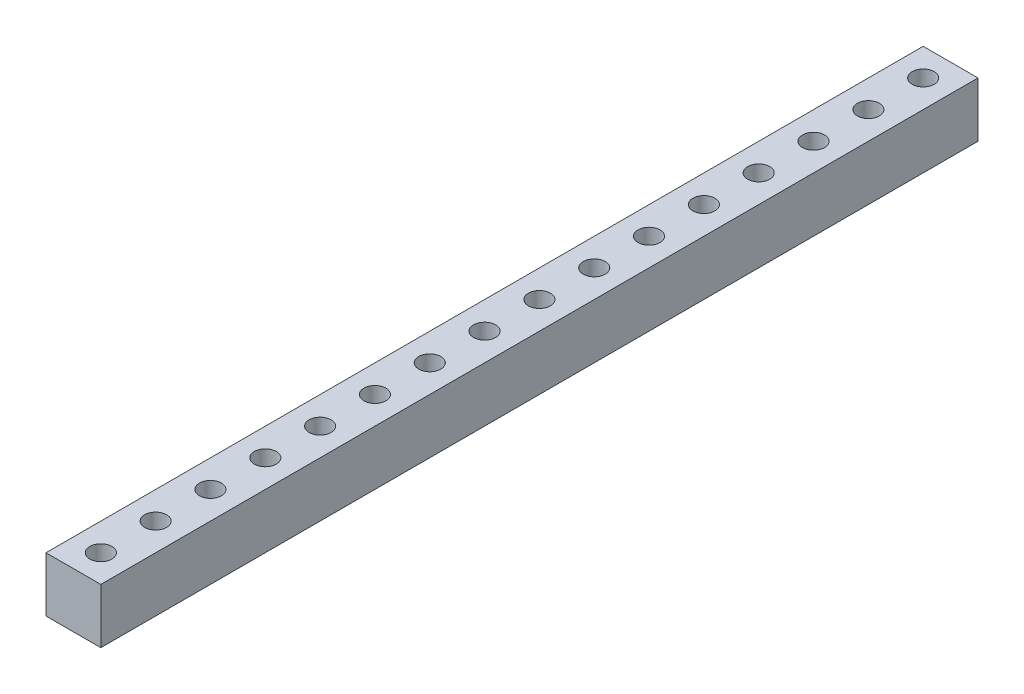
ISO-10303-21;
HEADER;
FILE_DESCRIPTION(('STEP AP214'),'2;1');
FILE_NAME('part.step','',(''),(''),'','','');
FILE_SCHEMA(('AUTOMOTIVE_DESIGN { 1 0 10303 214 1 1 1 1 }'));
ENDSEC;
DATA;
#1=APPLICATION_CONTEXT('core data for automotive mechanical design processes');
#2=APPLICATION_PROTOCOL_DEFINITION('international standard','automotive_design',2000,#1);
#3=PRODUCT_CONTEXT('',#1,'mechanical');
#4=PRODUCT('Part','Part','',(#3));
#5=PRODUCT_RELATED_PRODUCT_CATEGORY('part','',(#4));
#6=PRODUCT_DEFINITION_FORMATION('','',#4);
#7=PRODUCT_DEFINITION_CONTEXT('part definition',#1,'design');
#8=PRODUCT_DEFINITION('design','',#6,#7);
#9=PRODUCT_DEFINITION_SHAPE('','',#8);
#10=(LENGTH_UNIT() NAMED_UNIT(*) SI_UNIT(.MILLI.,.METRE.));
#11=(NAMED_UNIT(*) PLANE_ANGLE_UNIT() SI_UNIT($,.RADIAN.));
#12=(NAMED_UNIT(*) SI_UNIT($,.STERADIAN.) SOLID_ANGLE_UNIT());
#13=UNCERTAINTY_MEASURE_WITH_UNIT(LENGTH_MEASURE(1.E-05),#10,'distance_accuracy_value','');
#14=(GEOMETRIC_REPRESENTATION_CONTEXT(3) GLOBAL_UNCERTAINTY_ASSIGNED_CONTEXT((#13)) GLOBAL_UNIT_ASSIGNED_CONTEXT((#10,
#11,#12)) REPRESENTATION_CONTEXT('',''));
#15=CARTESIAN_POINT('',(0.,0.,0.));
#16=DIRECTION('',(0.,0.,1.));
#17=DIRECTION('',(1.,0.,0.));
#18=AXIS2_PLACEMENT_3D('',#15,#16,#17);
#19=CARTESIAN_POINT('',(2.54,1.27,20.32));
#20=DIRECTION('',(0.,-1.,0.));
#21=DIRECTION('',(0.,0.,-1.));
#22=AXIS2_PLACEMENT_3D('',#19,#20,#21);
#23=PLANE('',#22);
#24=CARTESIAN_POINT('',(1.27000000000001,1.27,-19.05));
#25=DIRECTION('',(0.,1.,0.));
#26=DIRECTION('',(0.,0.,1.));
#27=AXIS2_PLACEMENT_3D('',#24,#25,#26);
#28=CIRCLE('',#27,0.509999999999988);
#29=CARTESIAN_POINT('',(1.27000000000001,1.27,-18.54));
#30=VERTEX_POINT('',#29);
#31=EDGE_CURVE('E252',#30,#30,#28,.T.);
#32=ORIENTED_EDGE('',*,*,#31,.F.);
#33=EDGE_LOOP('',(#32));
#34=FACE_BOUND('',#33,.T.);
#35=CARTESIAN_POINT('',(1.27000000000001,1.27,-16.51));
#36=DIRECTION('',(0.,1.,0.));
#37=DIRECTION('',(0.,0.,1.));
#38=AXIS2_PLACEMENT_3D('',#35,#36,#37);
#39=CIRCLE('',#38,0.509999999999988);
#40=CARTESIAN_POINT('',(1.27000000000001,1.27,-16.));
#41=VERTEX_POINT('',#40);
#42=EDGE_CURVE('E244',#41,#41,#39,.T.);
#43=ORIENTED_EDGE('',*,*,#42,.F.);
#44=EDGE_LOOP('',(#43));
#45=FACE_BOUND('',#44,.T.);
#46=CARTESIAN_POINT('',(1.27000000000001,1.27,-13.97));
#47=DIRECTION('',(0.,1.,0.));
#48=DIRECTION('',(0.,0.,1.));
#49=AXIS2_PLACEMENT_3D('',#46,#47,#48);
#50=CIRCLE('',#49,0.509999999999988);
#51=CARTESIAN_POINT('',(1.27000000000001,1.27,-13.46));
#52=VERTEX_POINT('',#51);
#53=EDGE_CURVE('E236',#52,#52,#50,.T.);
#54=ORIENTED_EDGE('',*,*,#53,.F.);
#55=EDGE_LOOP('',(#54));
#56=FACE_BOUND('',#55,.T.);
#57=CARTESIAN_POINT('',(1.27000000000001,1.27,-11.43));
#58=DIRECTION('',(0.,1.,0.));
#59=DIRECTION('',(0.,0.,1.));
#60=AXIS2_PLACEMENT_3D('',#57,#58,#59);
#61=CIRCLE('',#60,0.509999999999988);
#62=CARTESIAN_POINT('',(1.27000000000001,1.27,-10.92));
#63=VERTEX_POINT('',#62);
#64=EDGE_CURVE('E228',#63,#63,#61,.T.);
#65=ORIENTED_EDGE('',*,*,#64,.F.);
#66=EDGE_LOOP('',(#65));
#67=FACE_BOUND('',#66,.T.);
#68=CARTESIAN_POINT('',(1.27000000000001,1.27,-8.89));
#69=DIRECTION('',(0.,1.,0.));
#70=DIRECTION('',(0.,0.,1.));
#71=AXIS2_PLACEMENT_3D('',#68,#69,#70);
#72=CIRCLE('',#71,0.509999999999988);
#73=CARTESIAN_POINT('',(1.27000000000001,1.27,-8.38000000000001));
#74=VERTEX_POINT('',#73);
#75=EDGE_CURVE('E220',#74,#74,#72,.T.);
#76=ORIENTED_EDGE('',*,*,#75,.F.);
#77=EDGE_LOOP('',(#76));
#78=FACE_BOUND('',#77,.T.);
#79=CARTESIAN_POINT('',(1.27000000000001,1.27,-6.35));
#80=DIRECTION('',(0.,1.,0.));
#81=DIRECTION('',(0.,0.,1.));
#82=AXIS2_PLACEMENT_3D('',#79,#80,#81);
#83=CIRCLE('',#82,0.509999999999988);
#84=CARTESIAN_POINT('',(1.27000000000001,1.27,-5.84000000000001));
#85=VERTEX_POINT('',#84);
#86=EDGE_CURVE('E212',#85,#85,#83,.T.);
#87=ORIENTED_EDGE('',*,*,#86,.F.);
#88=EDGE_LOOP('',(#87));
#89=FACE_BOUND('',#88,.T.);
#90=CARTESIAN_POINT('',(1.27000000000001,1.27,-1.27));
#91=DIRECTION('',(0.,1.,0.));
#92=DIRECTION('',(0.,0.,1.));
#93=AXIS2_PLACEMENT_3D('',#90,#91,#92);
#94=CIRCLE('',#93,0.509999999999988);
#95=CARTESIAN_POINT('',(1.27000000000001,1.27,-0.760000000000009));
#96=VERTEX_POINT('',#95);
#97=EDGE_CURVE('E196',#96,#96,#94,.T.);
#98=ORIENTED_EDGE('',*,*,#97,.F.);
#99=EDGE_LOOP('',(#98));
#100=FACE_BOUND('',#99,.T.);
#101=CARTESIAN_POINT('',(1.27000000000001,1.27,1.27));
#102=DIRECTION('',(0.,1.,0.));
#103=DIRECTION('',(0.,0.,1.));
#104=AXIS2_PLACEMENT_3D('',#101,#102,#103);
#105=CIRCLE('',#104,0.509999999999988);
#106=CARTESIAN_POINT('',(1.27000000000001,1.27,1.77999999999999));
#107=VERTEX_POINT('',#106);
#108=EDGE_CURVE('E188',#107,#107,#105,.T.);
#109=ORIENTED_EDGE('',*,*,#108,.F.);
#110=EDGE_LOOP('',(#109));
#111=FACE_BOUND('',#110,.T.);
#112=CARTESIAN_POINT('',(1.27000000000001,1.27,6.35));
#113=DIRECTION('',(0.,1.,0.));
#114=DIRECTION('',(0.,0.,1.));
#115=AXIS2_PLACEMENT_3D('',#112,#113,#114);
#116=CIRCLE('',#115,0.509999999999988);
#117=CARTESIAN_POINT('',(1.27000000000001,1.27,6.85999999999999));
#118=VERTEX_POINT('',#117);
#119=EDGE_CURVE('E172',#118,#118,#116,.T.);
#120=ORIENTED_EDGE('',*,*,#119,.F.);
#121=EDGE_LOOP('',(#120));
#122=FACE_BOUND('',#121,.T.);
#123=CARTESIAN_POINT('',(1.27000000000001,1.27,8.89));
#124=DIRECTION('',(0.,1.,0.));
#125=DIRECTION('',(0.,0.,1.));
#126=AXIS2_PLACEMENT_3D('',#123,#124,#125);
#127=CIRCLE('',#126,0.509999999999988);
#128=CARTESIAN_POINT('',(1.27000000000001,1.27,9.39999999999999));
#129=VERTEX_POINT('',#128);
#130=EDGE_CURVE('E164',#129,#129,#127,.T.);
#131=ORIENTED_EDGE('',*,*,#130,.F.);
#132=EDGE_LOOP('',(#131));
#133=FACE_BOUND('',#132,.T.);
#134=CARTESIAN_POINT('',(1.27000000000001,1.27,11.43));
#135=DIRECTION('',(0.,1.,0.));
#136=DIRECTION('',(0.,0.,1.));
#137=AXIS2_PLACEMENT_3D('',#134,#135,#136);
#138=CIRCLE('',#137,0.509999999999988);
#139=CARTESIAN_POINT('',(1.27000000000001,1.27,11.94));
#140=VERTEX_POINT('',#139);
#141=EDGE_CURVE('E156',#140,#140,#138,.T.);
#142=ORIENTED_EDGE('',*,*,#141,.F.);
#143=EDGE_LOOP('',(#142));
#144=FACE_BOUND('',#143,.T.);
#145=CARTESIAN_POINT('',(1.27000000000001,1.27,13.97));
#146=DIRECTION('',(0.,1.,0.));
#147=DIRECTION('',(0.,0.,1.));
#148=AXIS2_PLACEMENT_3D('',#145,#146,#147);
#149=CIRCLE('',#148,0.509999999999988);
#150=CARTESIAN_POINT('',(1.27000000000001,1.27,14.48));
#151=VERTEX_POINT('',#150);
#152=EDGE_CURVE('E148',#151,#151,#149,.T.);
#153=ORIENTED_EDGE('',*,*,#152,.F.);
#154=EDGE_LOOP('',(#153));
#155=FACE_BOUND('',#154,.T.);
#156=CARTESIAN_POINT('',(1.27000000000001,1.27,16.51));
#157=DIRECTION('',(0.,1.,0.));
#158=DIRECTION('',(0.,0.,1.));
#159=AXIS2_PLACEMENT_3D('',#156,#157,#158);
#160=CIRCLE('',#159,0.509999999999988);
#161=CARTESIAN_POINT('',(1.27000000000001,1.27,17.02));
#162=VERTEX_POINT('',#161);
#163=EDGE_CURVE('E140',#162,#162,#160,.T.);
#164=ORIENTED_EDGE('',*,*,#163,.F.);
#165=EDGE_LOOP('',(#164));
#166=FACE_BOUND('',#165,.T.);
#167=CARTESIAN_POINT('',(1.27000000000001,1.27,19.05));
#168=DIRECTION('',(0.,1.,0.));
#169=DIRECTION('',(0.,0.,1.));
#170=AXIS2_PLACEMENT_3D('',#167,#168,#169);
#171=CIRCLE('',#170,0.509999999999988);
#172=CARTESIAN_POINT('',(1.27000000000001,1.27,19.56));
#173=VERTEX_POINT('',#172);
#174=EDGE_CURVE('E132',#173,#173,#171,.T.);
#175=ORIENTED_EDGE('',*,*,#174,.F.);
#176=EDGE_LOOP('',(#175));
#177=FACE_BOUND('',#176,.T.);
#178=DIRECTION('',(0.,0.,1.));
#179=VECTOR('',#178,1.);
#180=CARTESIAN_POINT('',(0.,1.27,20.32));
#181=LINE('',#180,#179);
#182=CARTESIAN_POINT('',(0.,1.27,-20.32));
#183=VERTEX_POINT('',#182);
#184=CARTESIAN_POINT('',(0.,1.27,20.32));
#185=VERTEX_POINT('',#184);
#186=EDGE_CURVE('E97',#183,#185,#181,.T.);
#187=ORIENTED_EDGE('',*,*,#186,.T.);
#188=DIRECTION('',(-1.,0.,0.));
#189=VECTOR('',#188,1.);
#190=CARTESIAN_POINT('',(2.54,1.27,20.32));
#191=LINE('',#190,#189);
#192=CARTESIAN_POINT('',(2.54,1.27,20.32));
#193=VERTEX_POINT('',#192);
#194=EDGE_CURVE('E49',#193,#185,#191,.T.);
#195=ORIENTED_EDGE('',*,*,#194,.F.);
#196=DIRECTION('',(0.,0.,1.));
#197=VECTOR('',#196,1.);
#198=CARTESIAN_POINT('',(2.54,1.27,20.32));
#199=LINE('',#198,#197);
#200=CARTESIAN_POINT('',(2.54,1.27,-20.32));
#201=VERTEX_POINT('',#200);
#202=EDGE_CURVE('E87',#201,#193,#199,.T.);
#203=ORIENTED_EDGE('',*,*,#202,.F.);
#204=DIRECTION('',(-1.,0.,0.));
#205=VECTOR('',#204,1.);
#206=CARTESIAN_POINT('',(2.54,1.27,-20.32));
#207=LINE('',#206,#205);
#208=EDGE_CURVE('E11',#201,#183,#207,.T.);
#209=ORIENTED_EDGE('',*,*,#208,.T.);
#210=EDGE_LOOP('',(#187,#195,#203,#209));
#211=FACE_BOUND('',#210,.T.);
#212=CARTESIAN_POINT('',(1.27000000000001,1.27,3.81));
#213=DIRECTION('',(0.,1.,0.));
#214=DIRECTION('',(0.,0.,1.));
#215=AXIS2_PLACEMENT_3D('',#212,#213,#214);
#216=CIRCLE('',#215,0.509999999999988);
#217=CARTESIAN_POINT('',(1.27000000000001,1.27,4.31999999999999));
#218=VERTEX_POINT('',#217);
#219=EDGE_CURVE('E180',#218,#218,#216,.T.);
#220=ORIENTED_EDGE('',*,*,#219,.F.);
#221=EDGE_LOOP('',(#220));
#222=FACE_BOUND('',#221,.T.);
#223=CARTESIAN_POINT('',(1.27000000000001,1.27,-3.81));
#224=DIRECTION('',(0.,1.,0.));
#225=DIRECTION('',(0.,0.,1.));
#226=AXIS2_PLACEMENT_3D('',#223,#224,#225);
#227=CIRCLE('',#226,0.509999999999988);
#228=CARTESIAN_POINT('',(1.27000000000001,1.27,-3.30000000000001));
#229=VERTEX_POINT('',#228);
#230=EDGE_CURVE('E204',#229,#229,#227,.T.);
#231=ORIENTED_EDGE('',*,*,#230,.F.);
#232=EDGE_LOOP('',(#231));
#233=FACE_BOUND('',#232,.T.);
#234=ADVANCED_FACE('F39',(#34,#45,#56,#67,#78,#89,#100,#111,#122,#133,#144,#155,#166,#177,#211,
#222,#233),#23,.F.);
#235=CARTESIAN_POINT('',(2.54,-1.27,-20.32));
#236=DIRECTION('',(0.,0.,1.));
#237=DIRECTION('',(1.,0.,0.));
#238=AXIS2_PLACEMENT_3D('',#235,#236,#237);
#239=PLANE('',#238);
#240=DIRECTION('',(0.,1.,0.));
#241=VECTOR('',#240,1.);
#242=CARTESIAN_POINT('',(0.,-1.27,-20.32));
#243=LINE('',#242,#241);
#244=CARTESIAN_POINT('',(0.,-1.27,-20.32));
#245=VERTEX_POINT('',#244);
#246=EDGE_CURVE('E108',#245,#183,#243,.T.);
#247=ORIENTED_EDGE('',*,*,#246,.T.);
#248=ORIENTED_EDGE('',*,*,#208,.F.);
#249=DIRECTION('',(0.,1.,0.));
#250=VECTOR('',#249,1.);
#251=CARTESIAN_POINT('',(2.54,-1.27,-20.32));
#252=LINE('',#251,#250);
#253=CARTESIAN_POINT('',(2.54,-1.27,-20.32));
#254=VERTEX_POINT('',#253);
#255=EDGE_CURVE('E92',#254,#201,#252,.T.);
#256=ORIENTED_EDGE('',*,*,#255,.F.);
#257=DIRECTION('',(-1.,0.,0.));
#258=VECTOR('',#257,1.);
#259=CARTESIAN_POINT('',(2.54,-1.27,-20.32));
#260=LINE('',#259,#258);
#261=EDGE_CURVE('E104',#254,#245,#260,.T.);
#262=ORIENTED_EDGE('',*,*,#261,.T.);
#263=EDGE_LOOP('',(#247,#248,#256,#262));
#264=FACE_BOUND('',#263,.T.);
#265=ADVANCED_FACE('F41',(#264),#239,.F.);
#266=CARTESIAN_POINT('',(2.54,-1.27,20.32));
#267=DIRECTION('',(0.,0.,-1.));
#268=DIRECTION('',(-1.,0.,0.));
#269=AXIS2_PLACEMENT_3D('',#266,#267,#268);
#270=PLANE('',#269);
#271=DIRECTION('',(0.,-1.,0.));
#272=VECTOR('',#271,1.);
#273=CARTESIAN_POINT('',(0.,-1.27,20.32));
#274=LINE('',#273,#272);
#275=CARTESIAN_POINT('',(0.,-1.27,20.32));
#276=VERTEX_POINT('',#275);
#277=EDGE_CURVE('E74',#185,#276,#274,.T.);
#278=ORIENTED_EDGE('',*,*,#277,.T.);
#279=DIRECTION('',(-1.,0.,0.));
#280=VECTOR('',#279,1.);
#281=CARTESIAN_POINT('',(2.54,-1.27,20.32));
#282=LINE('',#281,#280);
#283=CARTESIAN_POINT('',(2.54,-1.27,20.32));
#284=VERTEX_POINT('',#283);
#285=EDGE_CURVE('E99',#284,#276,#282,.T.);
#286=ORIENTED_EDGE('',*,*,#285,.F.);
#287=DIRECTION('',(0.,-1.,0.));
#288=VECTOR('',#287,1.);
#289=CARTESIAN_POINT('',(2.54,-1.27,20.32));
#290=LINE('',#289,#288);
#291=EDGE_CURVE('E90',#193,#284,#290,.T.);
#292=ORIENTED_EDGE('',*,*,#291,.F.);
#293=ORIENTED_EDGE('',*,*,#194,.T.);
#294=EDGE_LOOP('',(#278,#286,#292,#293));
#295=FACE_BOUND('',#294,.T.);
#296=ADVANCED_FACE('F100',(#295),#270,.F.);
#297=CARTESIAN_POINT('',(2.54,-1.27,20.32));
#298=DIRECTION('',(0.,1.,0.));
#299=DIRECTION('',(0.,0.,1.));
#300=AXIS2_PLACEMENT_3D('',#297,#298,#299);
#301=PLANE('',#300);
#302=CARTESIAN_POINT('',(1.27000000000001,-1.27,-19.05));
#303=DIRECTION('',(0.,1.,0.));
#304=DIRECTION('',(0.,0.,1.));
#305=AXIS2_PLACEMENT_3D('',#302,#303,#304);
#306=CIRCLE('',#305,0.509999999999988);
#307=CARTESIAN_POINT('',(1.27000000000001,-1.27,-18.54));
#308=VERTEX_POINT('',#307);
#309=EDGE_CURVE('E248',#308,#308,#306,.T.);
#310=ORIENTED_EDGE('',*,*,#309,.T.);
#311=EDGE_LOOP('',(#310));
#312=FACE_BOUND('',#311,.T.);
#313=CARTESIAN_POINT('',(1.27000000000001,-1.27,-16.51));
#314=DIRECTION('',(0.,1.,0.));
#315=DIRECTION('',(0.,0.,1.));
#316=AXIS2_PLACEMENT_3D('',#313,#314,#315);
#317=CIRCLE('',#316,0.509999999999988);
#318=CARTESIAN_POINT('',(1.27000000000001,-1.27,-16.));
#319=VERTEX_POINT('',#318);
#320=EDGE_CURVE('E240',#319,#319,#317,.T.);
#321=ORIENTED_EDGE('',*,*,#320,.T.);
#322=EDGE_LOOP('',(#321));
#323=FACE_BOUND('',#322,.T.);
#324=CARTESIAN_POINT('',(1.27000000000001,-1.27,-13.97));
#325=DIRECTION('',(0.,1.,0.));
#326=DIRECTION('',(0.,0.,1.));
#327=AXIS2_PLACEMENT_3D('',#324,#325,#326);
#328=CIRCLE('',#327,0.509999999999988);
#329=CARTESIAN_POINT('',(1.27000000000001,-1.27,-13.46));
#330=VERTEX_POINT('',#329);
#331=EDGE_CURVE('E232',#330,#330,#328,.T.);
#332=ORIENTED_EDGE('',*,*,#331,.T.);
#333=EDGE_LOOP('',(#332));
#334=FACE_BOUND('',#333,.T.);
#335=CARTESIAN_POINT('',(1.27000000000001,-1.27,-11.43));
#336=DIRECTION('',(0.,1.,0.));
#337=DIRECTION('',(0.,0.,1.));
#338=AXIS2_PLACEMENT_3D('',#335,#336,#337);
#339=CIRCLE('',#338,0.509999999999988);
#340=CARTESIAN_POINT('',(1.27000000000001,-1.27,-10.92));
#341=VERTEX_POINT('',#340);
#342=EDGE_CURVE('E224',#341,#341,#339,.T.);
#343=ORIENTED_EDGE('',*,*,#342,.T.);
#344=EDGE_LOOP('',(#343));
#345=FACE_BOUND('',#344,.T.);
#346=CARTESIAN_POINT('',(1.27000000000001,-1.27,-8.89));
#347=DIRECTION('',(0.,1.,0.));
#348=DIRECTION('',(0.,0.,1.));
#349=AXIS2_PLACEMENT_3D('',#346,#347,#348);
#350=CIRCLE('',#349,0.509999999999988);
#351=CARTESIAN_POINT('',(1.27000000000001,-1.27,-8.38000000000001));
#352=VERTEX_POINT('',#351);
#353=EDGE_CURVE('E216',#352,#352,#350,.T.);
#354=ORIENTED_EDGE('',*,*,#353,.T.);
#355=EDGE_LOOP('',(#354));
#356=FACE_BOUND('',#355,.T.);
#357=CARTESIAN_POINT('',(1.27000000000001,-1.27,-6.35));
#358=DIRECTION('',(0.,1.,0.));
#359=DIRECTION('',(0.,0.,1.));
#360=AXIS2_PLACEMENT_3D('',#357,#358,#359);
#361=CIRCLE('',#360,0.509999999999988);
#362=CARTESIAN_POINT('',(1.27000000000001,-1.27,-5.84000000000001));
#363=VERTEX_POINT('',#362);
#364=EDGE_CURVE('E208',#363,#363,#361,.T.);
#365=ORIENTED_EDGE('',*,*,#364,.T.);
#366=EDGE_LOOP('',(#365));
#367=FACE_BOUND('',#366,.T.);
#368=CARTESIAN_POINT('',(1.27000000000001,-1.27,-3.81));
#369=DIRECTION('',(0.,1.,0.));
#370=DIRECTION('',(0.,0.,1.));
#371=AXIS2_PLACEMENT_3D('',#368,#369,#370);
#372=CIRCLE('',#371,0.509999999999988);
#373=CARTESIAN_POINT('',(1.27000000000001,-1.27,-3.30000000000001));
#374=VERTEX_POINT('',#373);
#375=EDGE_CURVE('E200',#374,#374,#372,.T.);
#376=ORIENTED_EDGE('',*,*,#375,.T.);
#377=EDGE_LOOP('',(#376));
#378=FACE_BOUND('',#377,.T.);
#379=CARTESIAN_POINT('',(1.27000000000001,-1.27,-1.27));
#380=DIRECTION('',(0.,1.,0.));
#381=DIRECTION('',(0.,0.,1.));
#382=AXIS2_PLACEMENT_3D('',#379,#380,#381);
#383=CIRCLE('',#382,0.509999999999988);
#384=CARTESIAN_POINT('',(1.27000000000001,-1.27,-0.760000000000009));
#385=VERTEX_POINT('',#384);
#386=EDGE_CURVE('E192',#385,#385,#383,.T.);
#387=ORIENTED_EDGE('',*,*,#386,.T.);
#388=EDGE_LOOP('',(#387));
#389=FACE_BOUND('',#388,.T.);
#390=CARTESIAN_POINT('',(1.27000000000001,-1.27,1.27));
#391=DIRECTION('',(0.,1.,0.));
#392=DIRECTION('',(0.,0.,1.));
#393=AXIS2_PLACEMENT_3D('',#390,#391,#392);
#394=CIRCLE('',#393,0.509999999999988);
#395=CARTESIAN_POINT('',(1.27000000000001,-1.27,1.77999999999999));
#396=VERTEX_POINT('',#395);
#397=EDGE_CURVE('E184',#396,#396,#394,.T.);
#398=ORIENTED_EDGE('',*,*,#397,.T.);
#399=EDGE_LOOP('',(#398));
#400=FACE_BOUND('',#399,.T.);
#401=CARTESIAN_POINT('',(1.27000000000001,-1.27,3.81));
#402=DIRECTION('',(0.,1.,0.));
#403=DIRECTION('',(0.,0.,1.));
#404=AXIS2_PLACEMENT_3D('',#401,#402,#403);
#405=CIRCLE('',#404,0.509999999999988);
#406=CARTESIAN_POINT('',(1.27000000000001,-1.27,4.31999999999999));
#407=VERTEX_POINT('',#406);
#408=EDGE_CURVE('E176',#407,#407,#405,.T.);
#409=ORIENTED_EDGE('',*,*,#408,.T.);
#410=EDGE_LOOP('',(#409));
#411=FACE_BOUND('',#410,.T.);
#412=CARTESIAN_POINT('',(1.27000000000001,-1.27,6.35));
#413=DIRECTION('',(0.,1.,0.));
#414=DIRECTION('',(0.,0.,1.));
#415=AXIS2_PLACEMENT_3D('',#412,#413,#414);
#416=CIRCLE('',#415,0.509999999999988);
#417=CARTESIAN_POINT('',(1.27000000000001,-1.27,6.85999999999999));
#418=VERTEX_POINT('',#417);
#419=EDGE_CURVE('E168',#418,#418,#416,.T.);
#420=ORIENTED_EDGE('',*,*,#419,.T.);
#421=EDGE_LOOP('',(#420));
#422=FACE_BOUND('',#421,.T.);
#423=CARTESIAN_POINT('',(1.27000000000001,-1.27,8.89));
#424=DIRECTION('',(0.,1.,0.));
#425=DIRECTION('',(0.,0.,1.));
#426=AXIS2_PLACEMENT_3D('',#423,#424,#425);
#427=CIRCLE('',#426,0.509999999999988);
#428=CARTESIAN_POINT('',(1.27000000000001,-1.27,9.39999999999999));
#429=VERTEX_POINT('',#428);
#430=EDGE_CURVE('E160',#429,#429,#427,.T.);
#431=ORIENTED_EDGE('',*,*,#430,.T.);
#432=EDGE_LOOP('',(#431));
#433=FACE_BOUND('',#432,.T.);
#434=CARTESIAN_POINT('',(1.27000000000001,-1.27,11.43));
#435=DIRECTION('',(0.,1.,0.));
#436=DIRECTION('',(0.,0.,1.));
#437=AXIS2_PLACEMENT_3D('',#434,#435,#436);
#438=CIRCLE('',#437,0.509999999999988);
#439=CARTESIAN_POINT('',(1.27000000000001,-1.27,11.94));
#440=VERTEX_POINT('',#439);
#441=EDGE_CURVE('E152',#440,#440,#438,.T.);
#442=ORIENTED_EDGE('',*,*,#441,.T.);
#443=EDGE_LOOP('',(#442));
#444=FACE_BOUND('',#443,.T.);
#445=CARTESIAN_POINT('',(1.27000000000001,-1.27,13.97));
#446=DIRECTION('',(0.,1.,0.));
#447=DIRECTION('',(0.,0.,1.));
#448=AXIS2_PLACEMENT_3D('',#445,#446,#447);
#449=CIRCLE('',#448,0.509999999999988);
#450=CARTESIAN_POINT('',(1.27000000000001,-1.27,14.48));
#451=VERTEX_POINT('',#450);
#452=EDGE_CURVE('E144',#451,#451,#449,.T.);
#453=ORIENTED_EDGE('',*,*,#452,.T.);
#454=EDGE_LOOP('',(#453));
#455=FACE_BOUND('',#454,.T.);
#456=CARTESIAN_POINT('',(1.27000000000001,-1.27,16.51));
#457=DIRECTION('',(0.,1.,0.));
#458=DIRECTION('',(0.,0.,1.));
#459=AXIS2_PLACEMENT_3D('',#456,#457,#458);
#460=CIRCLE('',#459,0.509999999999988);
#461=CARTESIAN_POINT('',(1.27000000000001,-1.27,17.02));
#462=VERTEX_POINT('',#461);
#463=EDGE_CURVE('E136',#462,#462,#460,.T.);
#464=ORIENTED_EDGE('',*,*,#463,.T.);
#465=EDGE_LOOP('',(#464));
#466=FACE_BOUND('',#465,.T.);
#467=CARTESIAN_POINT('',(1.27000000000001,-1.27,19.05));
#468=DIRECTION('',(0.,1.,0.));
#469=DIRECTION('',(0.,0.,1.));
#470=AXIS2_PLACEMENT_3D('',#467,#468,#469);
#471=CIRCLE('',#470,0.509999999999988);
#472=CARTESIAN_POINT('',(1.27000000000001,-1.27,19.56));
#473=VERTEX_POINT('',#472);
#474=EDGE_CURVE('E112',#473,#473,#471,.T.);
#475=ORIENTED_EDGE('',*,*,#474,.T.);
#476=EDGE_LOOP('',(#475));
#477=FACE_BOUND('',#476,.T.);
#478=DIRECTION('',(0.,0.,-1.));
#479=VECTOR('',#478,1.);
#480=CARTESIAN_POINT('',(0.,-1.27,20.32));
#481=LINE('',#480,#479);
#482=EDGE_CURVE('E80',#276,#245,#481,.T.);
#483=ORIENTED_EDGE('',*,*,#482,.T.);
#484=ORIENTED_EDGE('',*,*,#261,.F.);
#485=DIRECTION('',(0.,0.,-1.));
#486=VECTOR('',#485,1.);
#487=CARTESIAN_POINT('',(2.54,-1.27,20.32));
#488=LINE('',#487,#486);
#489=EDGE_CURVE('E57',#284,#254,#488,.T.);
#490=ORIENTED_EDGE('',*,*,#489,.F.);
#491=ORIENTED_EDGE('',*,*,#285,.T.);
#492=EDGE_LOOP('',(#483,#484,#490,#491));
#493=FACE_BOUND('',#492,.T.);
#494=ADVANCED_FACE('F122',(#312,#323,#334,#345,#356,#367,#378,#389,#400,#411,#422,#433,#444,
#455,#466,#477,#493),#301,.F.);
#495=CARTESIAN_POINT('',(2.54,0.,0.));
#496=DIRECTION('',(-1.,0.,0.));
#497=DIRECTION('',(0.,0.,1.));
#498=AXIS2_PLACEMENT_3D('',#495,#496,#497);
#499=PLANE('',#498);
#500=ORIENTED_EDGE('',*,*,#255,.T.);
#501=ORIENTED_EDGE('',*,*,#202,.T.);
#502=ORIENTED_EDGE('',*,*,#291,.T.);
#503=ORIENTED_EDGE('',*,*,#489,.T.);
#504=EDGE_LOOP('',(#500,#501,#502,#503));
#505=FACE_BOUND('',#504,.T.);
#506=ADVANCED_FACE('F88',(#505),#499,.F.);
#507=CARTESIAN_POINT('',(0.,0.,0.));
#508=DIRECTION('',(-1.,0.,0.));
#509=DIRECTION('',(0.,0.,1.));
#510=AXIS2_PLACEMENT_3D('',#507,#508,#509);
#511=PLANE('',#510);
#512=ORIENTED_EDGE('',*,*,#246,.F.);
#513=ORIENTED_EDGE('',*,*,#482,.F.);
#514=ORIENTED_EDGE('',*,*,#277,.F.);
#515=ORIENTED_EDGE('',*,*,#186,.F.);
#516=EDGE_LOOP('',(#512,#513,#514,#515));
#517=FACE_BOUND('',#516,.T.);
#518=ADVANCED_FACE('F125',(#517),#511,.T.);
#519=CARTESIAN_POINT('',(1.27000000000001,1.27,19.05));
#520=DIRECTION('',(0.,1.,0.));
#521=DIRECTION('',(0.,0.,1.));
#522=AXIS2_PLACEMENT_3D('',#519,#520,#521);
#523=CYLINDRICAL_SURFACE('',#522,0.509999999999988);
#524=ORIENTED_EDGE('',*,*,#474,.F.);
#525=EDGE_LOOP('',(#524));
#526=FACE_BOUND('',#525,.T.);
#527=ORIENTED_EDGE('',*,*,#174,.T.);
#528=EDGE_LOOP('',(#527));
#529=FACE_BOUND('',#528,.T.);
#530=ADVANCED_FACE('F287',(#526,#529),#523,.F.);
#531=CARTESIAN_POINT('',(1.27000000000001,1.27,16.51));
#532=DIRECTION('',(0.,1.,0.));
#533=DIRECTION('',(0.,0.,1.));
#534=AXIS2_PLACEMENT_3D('',#531,#532,#533);
#535=CYLINDRICAL_SURFACE('',#534,0.509999999999988);
#536=ORIENTED_EDGE('',*,*,#463,.F.);
#537=EDGE_LOOP('',(#536));
#538=FACE_BOUND('',#537,.T.);
#539=ORIENTED_EDGE('',*,*,#163,.T.);
#540=EDGE_LOOP('',(#539));
#541=FACE_BOUND('',#540,.T.);
#542=ADVANCED_FACE('F289',(#538,#541),#535,.F.);
#543=CARTESIAN_POINT('',(1.27000000000001,1.27,13.97));
#544=DIRECTION('',(0.,1.,0.));
#545=DIRECTION('',(0.,0.,1.));
#546=AXIS2_PLACEMENT_3D('',#543,#544,#545);
#547=CYLINDRICAL_SURFACE('',#546,0.509999999999988);
#548=ORIENTED_EDGE('',*,*,#452,.F.);
#549=EDGE_LOOP('',(#548));
#550=FACE_BOUND('',#549,.T.);
#551=ORIENTED_EDGE('',*,*,#152,.T.);
#552=EDGE_LOOP('',(#551));
#553=FACE_BOUND('',#552,.T.);
#554=ADVANCED_FACE('F296',(#550,#553),#547,.F.);
#555=CARTESIAN_POINT('',(1.27000000000001,1.27,11.43));
#556=DIRECTION('',(0.,1.,0.));
#557=DIRECTION('',(0.,0.,1.));
#558=AXIS2_PLACEMENT_3D('',#555,#556,#557);
#559=CYLINDRICAL_SURFACE('',#558,0.509999999999988);
#560=ORIENTED_EDGE('',*,*,#441,.F.);
#561=EDGE_LOOP('',(#560));
#562=FACE_BOUND('',#561,.T.);
#563=ORIENTED_EDGE('',*,*,#141,.T.);
#564=EDGE_LOOP('',(#563));
#565=FACE_BOUND('',#564,.T.);
#566=ADVANCED_FACE('F344',(#562,#565),#559,.F.);
#567=CARTESIAN_POINT('',(1.27000000000001,1.27,8.89));
#568=DIRECTION('',(0.,1.,0.));
#569=DIRECTION('',(0.,0.,1.));
#570=AXIS2_PLACEMENT_3D('',#567,#568,#569);
#571=CYLINDRICAL_SURFACE('',#570,0.509999999999988);
#572=ORIENTED_EDGE('',*,*,#430,.F.);
#573=EDGE_LOOP('',(#572));
#574=FACE_BOUND('',#573,.T.);
#575=ORIENTED_EDGE('',*,*,#130,.T.);
#576=EDGE_LOOP('',(#575));
#577=FACE_BOUND('',#576,.T.);
#578=ADVANCED_FACE('F353',(#574,#577),#571,.F.);
#579=CARTESIAN_POINT('',(1.27000000000001,1.27,6.35));
#580=DIRECTION('',(0.,1.,0.));
#581=DIRECTION('',(0.,0.,1.));
#582=AXIS2_PLACEMENT_3D('',#579,#580,#581);
#583=CYLINDRICAL_SURFACE('',#582,0.509999999999988);
#584=ORIENTED_EDGE('',*,*,#419,.F.);
#585=EDGE_LOOP('',(#584));
#586=FACE_BOUND('',#585,.T.);
#587=ORIENTED_EDGE('',*,*,#119,.T.);
#588=EDGE_LOOP('',(#587));
#589=FACE_BOUND('',#588,.T.);
#590=ADVANCED_FACE('F363',(#586,#589),#583,.F.);
#591=CARTESIAN_POINT('',(1.27000000000001,1.27,3.81));
#592=DIRECTION('',(0.,1.,0.));
#593=DIRECTION('',(0.,0.,1.));
#594=AXIS2_PLACEMENT_3D('',#591,#592,#593);
#595=CYLINDRICAL_SURFACE('',#594,0.509999999999988);
#596=ORIENTED_EDGE('',*,*,#408,.F.);
#597=EDGE_LOOP('',(#596));
#598=FACE_BOUND('',#597,.T.);
#599=ORIENTED_EDGE('',*,*,#219,.T.);
#600=EDGE_LOOP('',(#599));
#601=FACE_BOUND('',#600,.T.);
#602=ADVANCED_FACE('F373',(#598,#601),#595,.F.);
#603=CARTESIAN_POINT('',(1.27000000000001,1.27,1.27));
#604=DIRECTION('',(0.,1.,0.));
#605=DIRECTION('',(0.,0.,1.));
#606=AXIS2_PLACEMENT_3D('',#603,#604,#605);
#607=CYLINDRICAL_SURFACE('',#606,0.509999999999988);
#608=ORIENTED_EDGE('',*,*,#397,.F.);
#609=EDGE_LOOP('',(#608));
#610=FACE_BOUND('',#609,.T.);
#611=ORIENTED_EDGE('',*,*,#108,.T.);
#612=EDGE_LOOP('',(#611));
#613=FACE_BOUND('',#612,.T.);
#614=ADVANCED_FACE('F383',(#610,#613),#607,.F.);
#615=CARTESIAN_POINT('',(1.27000000000001,1.27,-1.27));
#616=DIRECTION('',(0.,1.,0.));
#617=DIRECTION('',(0.,0.,1.));
#618=AXIS2_PLACEMENT_3D('',#615,#616,#617);
#619=CYLINDRICAL_SURFACE('',#618,0.509999999999988);
#620=ORIENTED_EDGE('',*,*,#386,.F.);
#621=EDGE_LOOP('',(#620));
#622=FACE_BOUND('',#621,.T.);
#623=ORIENTED_EDGE('',*,*,#97,.T.);
#624=EDGE_LOOP('',(#623));
#625=FACE_BOUND('',#624,.T.);
#626=ADVANCED_FACE('F393',(#622,#625),#619,.F.);
#627=CARTESIAN_POINT('',(1.27000000000001,1.27,-3.81));
#628=DIRECTION('',(0.,1.,0.));
#629=DIRECTION('',(0.,0.,1.));
#630=AXIS2_PLACEMENT_3D('',#627,#628,#629);
#631=CYLINDRICAL_SURFACE('',#630,0.509999999999988);
#632=ORIENTED_EDGE('',*,*,#375,.F.);
#633=EDGE_LOOP('',(#632));
#634=FACE_BOUND('',#633,.T.);
#635=ORIENTED_EDGE('',*,*,#230,.T.);
#636=EDGE_LOOP('',(#635));
#637=FACE_BOUND('',#636,.T.);
#638=ADVANCED_FACE('F403',(#634,#637),#631,.F.);
#639=CARTESIAN_POINT('',(1.27000000000001,1.27,-6.35));
#640=DIRECTION('',(0.,1.,0.));
#641=DIRECTION('',(0.,0.,1.));
#642=AXIS2_PLACEMENT_3D('',#639,#640,#641);
#643=CYLINDRICAL_SURFACE('',#642,0.509999999999988);
#644=ORIENTED_EDGE('',*,*,#364,.F.);
#645=EDGE_LOOP('',(#644));
#646=FACE_BOUND('',#645,.T.);
#647=ORIENTED_EDGE('',*,*,#86,.T.);
#648=EDGE_LOOP('',(#647));
#649=FACE_BOUND('',#648,.T.);
#650=ADVANCED_FACE('F413',(#646,#649),#643,.F.);
#651=CARTESIAN_POINT('',(1.27000000000001,1.27,-8.89));
#652=DIRECTION('',(0.,1.,0.));
#653=DIRECTION('',(0.,0.,1.));
#654=AXIS2_PLACEMENT_3D('',#651,#652,#653);
#655=CYLINDRICAL_SURFACE('',#654,0.509999999999988);
#656=ORIENTED_EDGE('',*,*,#353,.F.);
#657=EDGE_LOOP('',(#656));
#658=FACE_BOUND('',#657,.T.);
#659=ORIENTED_EDGE('',*,*,#75,.T.);
#660=EDGE_LOOP('',(#659));
#661=FACE_BOUND('',#660,.T.);
#662=ADVANCED_FACE('F423',(#658,#661),#655,.F.);
#663=CARTESIAN_POINT('',(1.27000000000001,1.27,-11.43));
#664=DIRECTION('',(0.,1.,0.));
#665=DIRECTION('',(0.,0.,1.));
#666=AXIS2_PLACEMENT_3D('',#663,#664,#665);
#667=CYLINDRICAL_SURFACE('',#666,0.509999999999988);
#668=ORIENTED_EDGE('',*,*,#342,.F.);
#669=EDGE_LOOP('',(#668));
#670=FACE_BOUND('',#669,.T.);
#671=ORIENTED_EDGE('',*,*,#64,.T.);
#672=EDGE_LOOP('',(#671));
#673=FACE_BOUND('',#672,.T.);
#674=ADVANCED_FACE('F433',(#670,#673),#667,.F.);
#675=CARTESIAN_POINT('',(1.27000000000001,1.27,-13.97));
#676=DIRECTION('',(0.,1.,0.));
#677=DIRECTION('',(0.,0.,1.));
#678=AXIS2_PLACEMENT_3D('',#675,#676,#677);
#679=CYLINDRICAL_SURFACE('',#678,0.509999999999988);
#680=ORIENTED_EDGE('',*,*,#331,.F.);
#681=EDGE_LOOP('',(#680));
#682=FACE_BOUND('',#681,.T.);
#683=ORIENTED_EDGE('',*,*,#53,.T.);
#684=EDGE_LOOP('',(#683));
#685=FACE_BOUND('',#684,.T.);
#686=ADVANCED_FACE('F443',(#682,#685),#679,.F.);
#687=CARTESIAN_POINT('',(1.27000000000001,1.27,-16.51));
#688=DIRECTION('',(0.,1.,0.));
#689=DIRECTION('',(0.,0.,1.));
#690=AXIS2_PLACEMENT_3D('',#687,#688,#689);
#691=CYLINDRICAL_SURFACE('',#690,0.509999999999988);
#692=ORIENTED_EDGE('',*,*,#320,.F.);
#693=EDGE_LOOP('',(#692));
#694=FACE_BOUND('',#693,.T.);
#695=ORIENTED_EDGE('',*,*,#42,.T.);
#696=EDGE_LOOP('',(#695));
#697=FACE_BOUND('',#696,.T.);
#698=ADVANCED_FACE('F453',(#694,#697),#691,.F.);
#699=CARTESIAN_POINT('',(1.27000000000001,1.27,-19.05));
#700=DIRECTION('',(0.,1.,0.));
#701=DIRECTION('',(0.,0.,1.));
#702=AXIS2_PLACEMENT_3D('',#699,#700,#701);
#703=CYLINDRICAL_SURFACE('',#702,0.509999999999988);
#704=ORIENTED_EDGE('',*,*,#309,.F.);
#705=EDGE_LOOP('',(#704));
#706=FACE_BOUND('',#705,.T.);
#707=ORIENTED_EDGE('',*,*,#31,.T.);
#708=EDGE_LOOP('',(#707));
#709=FACE_BOUND('',#708,.T.);
#710=ADVANCED_FACE('F257',(#706,#709),#703,.F.);
#711=CLOSED_SHELL('',(#234,#265,#296,#494,#506,#518,#530,#542,#554,#566,#578,#590,#602,#614,
#626,#638,#650,#662,#674,#686,#698,#710));
#712=MANIFOLD_SOLID_BREP('B2',#711);
#713=ADVANCED_BREP_SHAPE_REPRESENTATION('',(#18,#712),#14);
#714=SHAPE_DEFINITION_REPRESENTATION(#9,#713);
ENDSEC;
END-ISO-10303-21;
